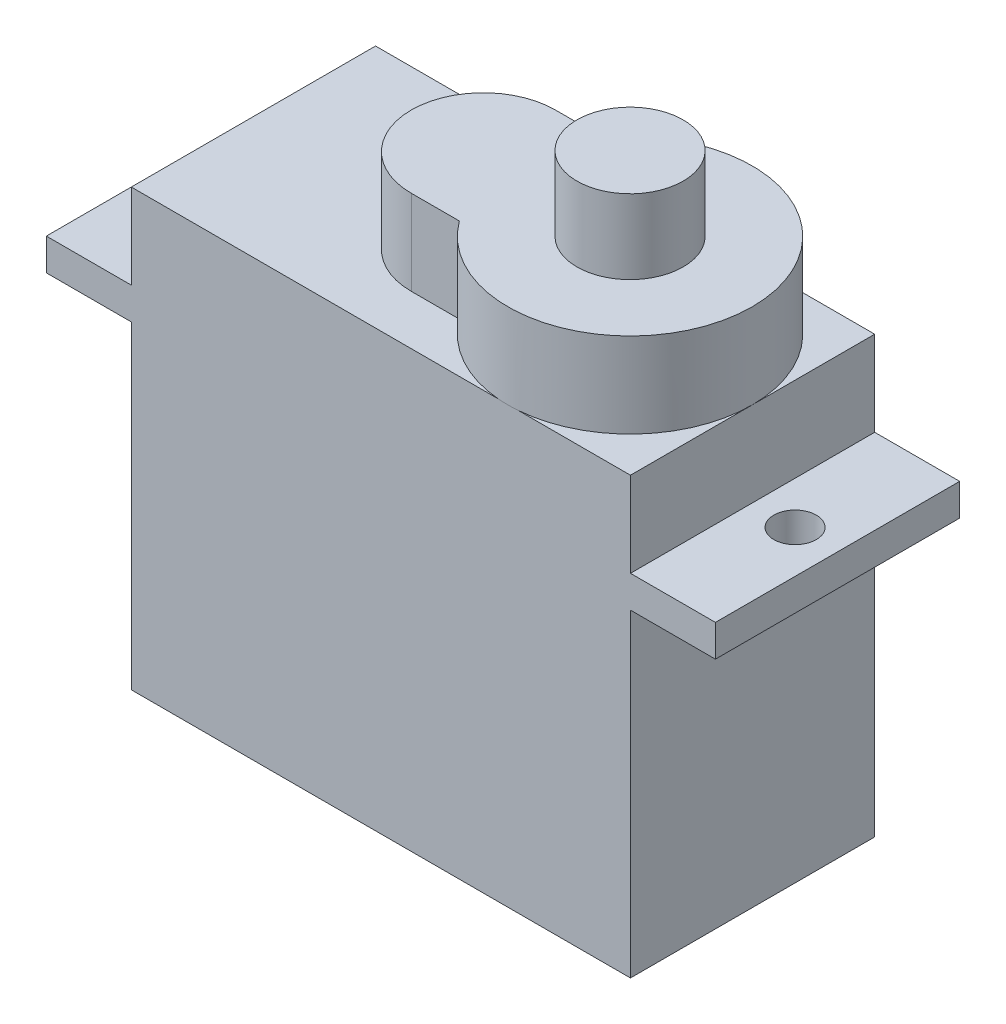
ISO-10303-21;
HEADER;
FILE_DESCRIPTION(('STEP AP214'),'2;1');
FILE_NAME('part.step','',(''),(''),'','','');
FILE_SCHEMA(('AUTOMOTIVE_DESIGN { 1 0 10303 214 1 1 1 1 }'));
ENDSEC;
DATA;
#1=APPLICATION_CONTEXT('core data for automotive mechanical design processes');
#2=APPLICATION_PROTOCOL_DEFINITION('international standard','automotive_design',2000,#1);
#3=PRODUCT_CONTEXT('',#1,'mechanical');
#4=PRODUCT('Part','Part','',(#3));
#5=PRODUCT_RELATED_PRODUCT_CATEGORY('part','',(#4));
#6=PRODUCT_DEFINITION_FORMATION('','',#4);
#7=PRODUCT_DEFINITION_CONTEXT('part definition',#1,'design');
#8=PRODUCT_DEFINITION('design','',#6,#7);
#9=PRODUCT_DEFINITION_SHAPE('','',#8);
#10=(LENGTH_UNIT() NAMED_UNIT(*) SI_UNIT(.MILLI.,.METRE.));
#11=(NAMED_UNIT(*) PLANE_ANGLE_UNIT() SI_UNIT($,.RADIAN.));
#12=(NAMED_UNIT(*) SI_UNIT($,.STERADIAN.) SOLID_ANGLE_UNIT());
#13=UNCERTAINTY_MEASURE_WITH_UNIT(LENGTH_MEASURE(1.E-05),#10,'distance_accuracy_value','');
#14=(GEOMETRIC_REPRESENTATION_CONTEXT(3) GLOBAL_UNCERTAINTY_ASSIGNED_CONTEXT((#13)) GLOBAL_UNIT_ASSIGNED_CONTEXT((#10,
#11,#12)) REPRESENTATION_CONTEXT('',''));
#15=CARTESIAN_POINT('',(0.,0.,0.));
#16=DIRECTION('',(0.,0.,1.));
#17=DIRECTION('',(1.,0.,0.));
#18=AXIS2_PLACEMENT_3D('',#15,#16,#17);
#19=CARTESIAN_POINT('',(15.22,28.,-8.261449094));
#20=DIRECTION('',(0.,1.,0.));
#21=DIRECTION('',(0.,0.,1.));
#22=AXIS2_PLACEMENT_3D('',#19,#20,#21);
#23=PLANE('',#22);
#24=CARTESIAN_POINT('',(17.75,28.,-5.731449094));
#25=DIRECTION('',(0.,-1.,0.));
#26=DIRECTION('',(1.,0.,0.));
#27=AXIS2_PLACEMENT_3D('',#24,#25,#26);
#28=CIRCLE('',#27,2.5);
#29=CARTESIAN_POINT('',(20.25,28.,-5.731449094));
#30=VERTEX_POINT('',#29);
#31=EDGE_CURVE('E21',#30,#30,#28,.F.);
#32=ORIENTED_EDGE('',*,*,#31,.T.);
#33=EDGE_LOOP('',(#32));
#34=FACE_BOUND('',#33,.T.);
#35=ADVANCED_FACE('F17',(#34),#23,.T.);
#36=CARTESIAN_POINT('',(17.75,28.,-5.731449094));
#37=DIRECTION('',(0.,-1.,0.));
#38=DIRECTION('',(1.,0.,0.));
#39=AXIS2_PLACEMENT_3D('',#36,#37,#38);
#40=CYLINDRICAL_SURFACE('',#39,2.5);
#41=CARTESIAN_POINT('',(17.75,24.5,-5.731449094));
#42=DIRECTION('',(0.,-1.,0.));
#43=DIRECTION('',(1.,0.,0.));
#44=AXIS2_PLACEMENT_3D('',#41,#42,#43);
#45=CIRCLE('',#44,2.5);
#46=CARTESIAN_POINT('',(20.25,24.5,-5.731449094));
#47=VERTEX_POINT('',#46);
#48=EDGE_CURVE('E162',#47,#47,#45,.T.);
#49=ORIENTED_EDGE('',*,*,#48,.F.);
#50=EDGE_LOOP('',(#49));
#51=FACE_BOUND('',#50,.T.);
#52=ORIENTED_EDGE('',*,*,#31,.F.);
#53=EDGE_LOOP('',(#52));
#54=FACE_BOUND('',#53,.T.);
#55=ADVANCED_FACE('F390',(#51,#54),#40,.T.);
#56=CARTESIAN_POINT('',(7.353508391,24.5,-11.550449094));
#57=DIRECTION('',(0.,1.,0.));
#58=DIRECTION('',(0.,0.,1.));
#59=AXIS2_PLACEMENT_3D('',#56,#57,#58);
#60=PLANE('',#59);
#61=ORIENTED_EDGE('',*,*,#48,.T.);
#62=EDGE_LOOP('',(#61));
#63=FACE_BOUND('',#62,.T.);
#64=CARTESIAN_POINT('',(17.75,24.5,-5.731449094));
#65=DIRECTION('',(0.,-1.,0.));
#66=DIRECTION('',(1.,0.,0.));
#67=AXIS2_PLACEMENT_3D('',#64,#65,#66);
#68=CIRCLE('',#67,5.75);
#69=CARTESIAN_POINT('',(13.1081034301138,24.5,-2.338029545));
#70=VERTEX_POINT('',#69);
#71=CARTESIAN_POINT('',(13.1081034289888,24.5,-9.12486864130538));
#72=VERTEX_POINT('',#71);
#73=EDGE_CURVE('E137',#70,#72,#68,.F.);
#74=ORIENTED_EDGE('',*,*,#73,.T.);
#75=DIRECTION('',(-1.,0.,0.));
#76=VECTOR('',#75,1.);
#77=CARTESIAN_POINT('',(11.975666256,24.5,-9.124868642));
#78=LINE('',#77,#76);
#79=CARTESIAN_POINT('',(10.843229082,24.5,-9.124868642));
#80=VERTEX_POINT('',#79);
#81=EDGE_CURVE('E166',#72,#80,#78,.T.);
#82=ORIENTED_EDGE('',*,*,#81,.T.);
#83=CARTESIAN_POINT('',(10.843229082,24.5,-5.731449094));
#84=DIRECTION('',(0.,-1.,0.));
#85=DIRECTION('',(1.,0.,0.));
#86=AXIS2_PLACEMENT_3D('',#83,#84,#85);
#87=CIRCLE('',#86,3.393419548);
#88=CARTESIAN_POINT('',(10.843229081304,24.5,-2.3380295455));
#89=VERTEX_POINT('',#88);
#90=EDGE_CURVE('E158',#80,#89,#87,.F.);
#91=ORIENTED_EDGE('',*,*,#90,.T.);
#92=DIRECTION('',(1.,0.,0.));
#93=VECTOR('',#92,1.);
#94=CARTESIAN_POINT('',(11.975666256,24.5,-2.338029545));
#95=LINE('',#94,#93);
#96=EDGE_CURVE('E155',#89,#70,#95,.T.);
#97=ORIENTED_EDGE('',*,*,#96,.T.);
#98=EDGE_LOOP('',(#74,#82,#91,#97));
#99=FACE_BOUND('',#98,.T.);
#100=ADVANCED_FACE('F161',(#63,#99),#60,.T.);
#101=CARTESIAN_POINT('',(13.10810343,20.5,-2.338029545));
#102=DIRECTION('',(0.,0.,-1.));
#103=DIRECTION('',(-1.,0.,0.));
#104=AXIS2_PLACEMENT_3D('',#101,#102,#103);
#105=PLANE('',#104);
#106=DIRECTION('',(0.,-1.,0.));
#107=VECTOR('',#106,1.);
#108=CARTESIAN_POINT('',(13.10810343,22.5,-2.338029545));
#109=LINE('',#108,#107);
#110=CARTESIAN_POINT('',(13.108103429931,20.5,-2.33802954525));
#111=VERTEX_POINT('',#110);
#112=EDGE_CURVE('E141',#70,#111,#109,.T.);
#113=ORIENTED_EDGE('',*,*,#112,.F.);
#114=ORIENTED_EDGE('',*,*,#96,.F.);
#115=DIRECTION('',(0.,1.,0.));
#116=VECTOR('',#115,1.);
#117=CARTESIAN_POINT('',(10.843229080608,22.5,-2.33802954600001));
#118=LINE('',#117,#116);
#119=CARTESIAN_POINT('',(10.843229081304,20.5,-2.33802954575));
#120=VERTEX_POINT('',#119);
#121=EDGE_CURVE('E194',#89,#120,#118,.F.);
#122=ORIENTED_EDGE('',*,*,#121,.T.);
#123=DIRECTION('',(-1.,0.,0.));
#124=VECTOR('',#123,1.);
#125=CARTESIAN_POINT('',(11.75,20.5,-2.3380295455));
#126=LINE('',#125,#124);
#127=EDGE_CURVE('E157',#111,#120,#126,.T.);
#128=ORIENTED_EDGE('',*,*,#127,.F.);
#129=EDGE_LOOP('',(#113,#114,#122,#128));
#130=FACE_BOUND('',#129,.T.);
#131=ADVANCED_FACE('F153',(#130),#105,.F.);
#132=CARTESIAN_POINT('',(10.843229082,24.5,-5.731449094));
#133=DIRECTION('',(0.,-1.,0.));
#134=DIRECTION('',(1.,0.,0.));
#135=AXIS2_PLACEMENT_3D('',#132,#133,#134);
#136=CYLINDRICAL_SURFACE('',#135,3.393419548);
#137=ORIENTED_EDGE('',*,*,#121,.F.);
#138=ORIENTED_EDGE('',*,*,#90,.F.);
#139=DIRECTION('',(0.,-1.,0.));
#140=VECTOR('',#139,1.);
#141=CARTESIAN_POINT('',(10.843229082,22.5,-9.124868642));
#142=LINE('',#141,#140);
#143=CARTESIAN_POINT('',(10.843229082,20.5,-9.1248686395));
#144=VERTEX_POINT('',#143);
#145=EDGE_CURVE('E197',#80,#144,#142,.T.);
#146=ORIENTED_EDGE('',*,*,#145,.T.);
#147=CARTESIAN_POINT('',(10.843229082,20.5,-5.731449094));
#148=DIRECTION('',(0.,-1.,0.));
#149=DIRECTION('',(1.,0.,0.));
#150=AXIS2_PLACEMENT_3D('',#147,#148,#149);
#151=CIRCLE('',#150,3.393419548);
#152=EDGE_CURVE('E189',#120,#144,#151,.T.);
#153=ORIENTED_EDGE('',*,*,#152,.F.);
#154=EDGE_LOOP('',(#137,#138,#146,#153));
#155=FACE_BOUND('',#154,.T.);
#156=ADVANCED_FACE('F360',(#155),#136,.T.);
#157=CARTESIAN_POINT('',(10.843229082,20.5,-9.124868642));
#158=DIRECTION('',(0.,0.,1.));
#159=DIRECTION('',(1.,0.,0.));
#160=AXIS2_PLACEMENT_3D('',#157,#158,#159);
#161=PLANE('',#160);
#162=ORIENTED_EDGE('',*,*,#145,.F.);
#163=ORIENTED_EDGE('',*,*,#81,.F.);
#164=DIRECTION('',(0.,1.,0.));
#165=VECTOR('',#164,1.);
#166=CARTESIAN_POINT('',(13.108103428481,22.5,-9.12486864061076));
#167=LINE('',#166,#165);
#168=CARTESIAN_POINT('',(13.1081034271612,20.5,-9.12486863880538));
#169=VERTEX_POINT('',#168);
#170=EDGE_CURVE('E145',#72,#169,#167,.F.);
#171=ORIENTED_EDGE('',*,*,#170,.T.);
#172=DIRECTION('',(1.,0.,0.));
#173=VECTOR('',#172,1.);
#174=CARTESIAN_POINT('',(11.75,20.5,-9.124868637));
#175=LINE('',#174,#173);
#176=EDGE_CURVE('E188',#144,#169,#175,.T.);
#177=ORIENTED_EDGE('',*,*,#176,.F.);
#178=EDGE_LOOP('',(#162,#163,#171,#177));
#179=FACE_BOUND('',#178,.T.);
#180=ADVANCED_FACE('F362',(#179),#161,.F.);
#181=CARTESIAN_POINT('',(17.75,24.5,-5.731449094));
#182=DIRECTION('',(0.,-1.,0.));
#183=DIRECTION('',(1.,0.,0.));
#184=AXIS2_PLACEMENT_3D('',#181,#182,#183);
#185=CYLINDRICAL_SURFACE('',#184,5.75);
#186=ORIENTED_EDGE('',*,*,#73,.F.);
#187=ORIENTED_EDGE('',*,*,#112,.T.);
#188=CARTESIAN_POINT('',(17.75,20.5,-5.731449094));
#189=DIRECTION('',(0.,-1.,0.));
#190=DIRECTION('',(1.,0.,0.));
#191=AXIS2_PLACEMENT_3D('',#188,#189,#190);
#192=CIRCLE('',#191,5.75);
#193=CARTESIAN_POINT('',(17.2884902113306,20.5,0.));
#194=VERTEX_POINT('',#193);
#195=EDGE_CURVE('E191',#194,#111,#192,.T.);
#196=ORIENTED_EDGE('',*,*,#195,.F.);
#197=CARTESIAN_POINT('',(17.75,20.5,-5.731449094));
#198=DIRECTION('',(0.,-1.,0.));
#199=DIRECTION('',(1.,0.,0.));
#200=AXIS2_PLACEMENT_3D('',#197,#198,#199);
#201=CIRCLE('',#200,5.75);
#202=CARTESIAN_POINT('',(18.2115097892697,20.5,1.20584965623838E-11));
#203=VERTEX_POINT('',#202);
#204=EDGE_CURVE('E183',#194,#203,#201,.F.);
#205=ORIENTED_EDGE('',*,*,#204,.T.);
#206=CARTESIAN_POINT('',(17.75,20.5,-5.731449094));
#207=DIRECTION('',(0.,-1.,0.));
#208=DIRECTION('',(1.,0.,0.));
#209=AXIS2_PLACEMENT_3D('',#206,#207,#208);
#210=CIRCLE('',#209,5.75);
#211=CARTESIAN_POINT('',(23.5,20.5,-5.73144909491033));
#212=VERTEX_POINT('',#211);
#213=EDGE_CURVE('E180',#212,#203,#210,.T.);
#214=ORIENTED_EDGE('',*,*,#213,.F.);
#215=CARTESIAN_POINT('',(17.75,20.5,-5.731449094));
#216=DIRECTION('',(0.,-1.,0.));
#217=DIRECTION('',(1.,0.,0.));
#218=AXIS2_PLACEMENT_3D('',#215,#216,#217);
#219=CIRCLE('',#218,5.75);
#220=EDGE_CURVE('E186',#169,#212,#219,.T.);
#221=ORIENTED_EDGE('',*,*,#220,.F.);
#222=ORIENTED_EDGE('',*,*,#170,.F.);
#223=EDGE_LOOP('',(#186,#187,#196,#205,#214,#221,#222));
#224=FACE_BOUND('',#223,.T.);
#225=ADVANCED_FACE('F139',(#224),#185,.T.);
#226=CARTESIAN_POINT('',(27.5,15.,0.));
#227=DIRECTION('',(1.,0.,0.));
#228=DIRECTION('',(0.,0.,-1.));
#229=AXIS2_PLACEMENT_3D('',#226,#227,#228);
#230=PLANE('',#229);
#231=DIRECTION('',(0.,0.,-1.));
#232=VECTOR('',#231,1.);
#233=CARTESIAN_POINT('',(27.5,16.5,-5.75));
#234=LINE('',#233,#232);
#235=CARTESIAN_POINT('',(27.5,16.500000001125,0.));
#236=VERTEX_POINT('',#235);
#237=CARTESIAN_POINT('',(27.5,16.500000001125,-11.5));
#238=VERTEX_POINT('',#237);
#239=EDGE_CURVE('E179',#236,#238,#234,.T.);
#240=ORIENTED_EDGE('',*,*,#239,.F.);
#241=DIRECTION('',(0.,-1.,0.));
#242=VECTOR('',#241,1.);
#243=CARTESIAN_POINT('',(27.5,15.75,0.));
#244=LINE('',#243,#242);
#245=CARTESIAN_POINT('',(27.5,14.999999999625,0.));
#246=VERTEX_POINT('',#245);
#247=EDGE_CURVE('E192',#236,#246,#244,.T.);
#248=ORIENTED_EDGE('',*,*,#247,.T.);
#249=DIRECTION('',(0.,0.,-1.));
#250=VECTOR('',#249,1.);
#251=CARTESIAN_POINT('',(27.5,15.,-5.75));
#252=LINE('',#251,#250);
#253=CARTESIAN_POINT('',(27.5,14.999999999625,-11.5));
#254=VERTEX_POINT('',#253);
#255=EDGE_CURVE('E175',#246,#254,#252,.T.);
#256=ORIENTED_EDGE('',*,*,#255,.T.);
#257=DIRECTION('',(0.,1.,0.));
#258=VECTOR('',#257,1.);
#259=CARTESIAN_POINT('',(27.5,15.75,-11.5));
#260=LINE('',#259,#258);
#261=EDGE_CURVE('E150',#254,#238,#260,.T.);
#262=ORIENTED_EDGE('',*,*,#261,.T.);
#263=EDGE_LOOP('',(#240,#248,#256,#262));
#264=FACE_BOUND('',#263,.T.);
#265=ADVANCED_FACE('F370',(#264),#230,.T.);
#266=CARTESIAN_POINT('',(25.5,15.,-5.75));
#267=DIRECTION('',(0.,1.,0.));
#268=DIRECTION('',(-1.,0.,0.));
#269=AXIS2_PLACEMENT_3D('',#266,#267,#268);
#270=CYLINDRICAL_SURFACE('',#269,1.);
#271=CARTESIAN_POINT('',(25.5,16.5,-5.75));
#272=DIRECTION('',(0.,1.,0.));
#273=DIRECTION('',(-1.,0.,0.));
#274=AXIS2_PLACEMENT_3D('',#271,#272,#273);
#275=CIRCLE('',#274,1.);
#276=CARTESIAN_POINT('',(24.5,16.5,-5.75));
#277=VERTEX_POINT('',#276);
#278=EDGE_CURVE('E176',#277,#277,#275,.F.);
#279=ORIENTED_EDGE('',*,*,#278,.F.);
#280=EDGE_LOOP('',(#279));
#281=FACE_BOUND('',#280,.T.);
#282=CARTESIAN_POINT('',(25.5,15.,-5.75));
#283=DIRECTION('',(0.,1.,0.));
#284=DIRECTION('',(-1.,0.,0.));
#285=AXIS2_PLACEMENT_3D('',#282,#283,#284);
#286=CIRCLE('',#285,1.);
#287=CARTESIAN_POINT('',(24.5,15.,-5.75));
#288=VERTEX_POINT('',#287);
#289=EDGE_CURVE('E171',#288,#288,#286,.F.);
#290=ORIENTED_EDGE('',*,*,#289,.T.);
#291=EDGE_LOOP('',(#290));
#292=FACE_BOUND('',#291,.T.);
#293=ADVANCED_FACE('F386',(#281,#292),#270,.F.);
#294=CARTESIAN_POINT('',(0.,20.5,-11.5));
#295=DIRECTION('',(0.,1.,0.));
#296=DIRECTION('',(0.,0.,1.));
#297=AXIS2_PLACEMENT_3D('',#294,#295,#296);
#298=PLANE('',#297);
#299=ORIENTED_EDGE('',*,*,#176,.T.);
#300=ORIENTED_EDGE('',*,*,#220,.T.);
#301=DIRECTION('',(0.,0.,-1.));
#302=VECTOR('',#301,1.);
#303=CARTESIAN_POINT('',(23.5,20.5,-5.75));
#304=LINE('',#303,#302);
#305=CARTESIAN_POINT('',(23.4999999999375,20.5,-11.5));
#306=VERTEX_POINT('',#305);
#307=EDGE_CURVE('E211',#212,#306,#304,.T.);
#308=ORIENTED_EDGE('',*,*,#307,.T.);
#309=DIRECTION('',(-1.,0.,0.));
#310=VECTOR('',#309,1.);
#311=CARTESIAN_POINT('',(11.75,20.5,-11.5));
#312=LINE('',#311,#310);
#313=CARTESIAN_POINT('',(0.,20.5,-11.5));
#314=VERTEX_POINT('',#313);
#315=EDGE_CURVE('E207',#306,#314,#312,.T.);
#316=ORIENTED_EDGE('',*,*,#315,.T.);
#317=DIRECTION('',(0.,0.,1.));
#318=VECTOR('',#317,1.);
#319=CARTESIAN_POINT('',(0.,20.5,-5.75));
#320=LINE('',#319,#318);
#321=CARTESIAN_POINT('',(3.33329573433868E-10,20.5,0.));
#322=VERTEX_POINT('',#321);
#323=EDGE_CURVE('E237',#314,#322,#320,.T.);
#324=ORIENTED_EDGE('',*,*,#323,.T.);
#325=DIRECTION('',(1.,0.,0.));
#326=VECTOR('',#325,1.);
#327=CARTESIAN_POINT('',(11.75,20.5,0.));
#328=LINE('',#327,#326);
#329=EDGE_CURVE('E246',#322,#194,#328,.T.);
#330=ORIENTED_EDGE('',*,*,#329,.T.);
#331=ORIENTED_EDGE('',*,*,#195,.T.);
#332=ORIENTED_EDGE('',*,*,#127,.T.);
#333=ORIENTED_EDGE('',*,*,#152,.T.);
#334=EDGE_LOOP('',(#299,#300,#308,#316,#324,#330,#331,#332,#333));
#335=FACE_BOUND('',#334,.T.);
#336=ADVANCED_FACE('F343',(#335),#298,.T.);
#337=CARTESIAN_POINT('',(17.282952094,20.5,0.));
#338=DIRECTION('',(0.,1.,0.));
#339=DIRECTION('',(0.,0.,1.));
#340=AXIS2_PLACEMENT_3D('',#337,#338,#339);
#341=PLANE('',#340);
#342=DIRECTION('',(1.,0.,0.));
#343=VECTOR('',#342,1.);
#344=CARTESIAN_POINT('',(11.75,20.5,0.));
#345=LINE('',#344,#343);
#346=EDGE_CURVE('E254',#194,#203,#345,.T.);
#347=ORIENTED_EDGE('',*,*,#346,.T.);
#348=ORIENTED_EDGE('',*,*,#204,.F.);
#349=EDGE_LOOP('',(#347,#348));
#350=FACE_BOUND('',#349,.T.);
#351=ADVANCED_FACE('F356',(#350),#341,.F.);
#352=CARTESIAN_POINT('',(18.179778847,20.5,-5.765837788));
#353=DIRECTION('',(0.,1.,0.));
#354=DIRECTION('',(0.,0.,1.));
#355=AXIS2_PLACEMENT_3D('',#352,#353,#354);
#356=PLANE('',#355);
#357=DIRECTION('',(1.,0.,0.));
#358=VECTOR('',#357,1.);
#359=CARTESIAN_POINT('',(11.75,20.5,0.));
#360=LINE('',#359,#358);
#361=CARTESIAN_POINT('',(23.49999999975,20.5,0.));
#362=VERTEX_POINT('',#361);
#363=EDGE_CURVE('E265',#203,#362,#360,.T.);
#364=ORIENTED_EDGE('',*,*,#363,.T.);
#365=DIRECTION('',(0.,0.,-1.));
#366=VECTOR('',#365,1.);
#367=CARTESIAN_POINT('',(23.5,20.5,-5.75));
#368=LINE('',#367,#366);
#369=EDGE_CURVE('E182',#362,#212,#368,.T.);
#370=ORIENTED_EDGE('',*,*,#369,.T.);
#371=ORIENTED_EDGE('',*,*,#213,.T.);
#372=EDGE_LOOP('',(#364,#370,#371));
#373=FACE_BOUND('',#372,.T.);
#374=ADVANCED_FACE('F350',(#373),#356,.T.);
#375=CARTESIAN_POINT('',(23.5,16.5,-11.5));
#376=DIRECTION('',(-1.,0.,0.));
#377=DIRECTION('',(0.,0.,1.));
#378=AXIS2_PLACEMENT_3D('',#375,#376,#377);
#379=PLANE('',#378);
#380=DIRECTION('',(0.,1.,0.));
#381=VECTOR('',#380,1.);
#382=CARTESIAN_POINT('',(23.4999999995,10.25,-11.5));
#383=LINE('',#382,#381);
#384=CARTESIAN_POINT('',(23.499999999875,16.500000001125,-11.5));
#385=VERTEX_POINT('',#384);
#386=EDGE_CURVE('E204',#385,#306,#383,.T.);
#387=ORIENTED_EDGE('',*,*,#386,.T.);
#388=ORIENTED_EDGE('',*,*,#307,.F.);
#389=ORIENTED_EDGE('',*,*,#369,.F.);
#390=DIRECTION('',(0.,-1.,0.));
#391=VECTOR('',#390,1.);
#392=CARTESIAN_POINT('',(23.4999999995,10.25,0.));
#393=LINE('',#392,#391);
#394=CARTESIAN_POINT('',(23.499999999875,16.500000001125,0.));
#395=VERTEX_POINT('',#394);
#396=EDGE_CURVE('E261',#362,#395,#393,.T.);
#397=ORIENTED_EDGE('',*,*,#396,.T.);
#398=DIRECTION('',(0.,0.,1.));
#399=VECTOR('',#398,1.);
#400=CARTESIAN_POINT('',(23.5,16.5,-5.75));
#401=LINE('',#400,#399);
#402=EDGE_CURVE('E213',#385,#395,#401,.T.);
#403=ORIENTED_EDGE('',*,*,#402,.F.);
#404=EDGE_LOOP('',(#387,#388,#389,#397,#403));
#405=FACE_BOUND('',#404,.T.);
#406=ADVANCED_FACE('F347',(#405),#379,.F.);
#407=CARTESIAN_POINT('',(23.5,16.5,-11.5));
#408=DIRECTION('',(0.,1.,0.));
#409=DIRECTION('',(0.,0.,1.));
#410=AXIS2_PLACEMENT_3D('',#407,#408,#409);
#411=PLANE('',#410);
#412=ORIENTED_EDGE('',*,*,#278,.T.);
#413=EDGE_LOOP('',(#412));
#414=FACE_BOUND('',#413,.T.);
#415=ORIENTED_EDGE('',*,*,#239,.T.);
#416=DIRECTION('',(-1.,0.,0.));
#417=VECTOR('',#416,1.);
#418=CARTESIAN_POINT('',(11.75,16.5000000045,-11.5));
#419=LINE('',#418,#417);
#420=EDGE_CURVE('E208',#238,#385,#419,.T.);
#421=ORIENTED_EDGE('',*,*,#420,.T.);
#422=ORIENTED_EDGE('',*,*,#402,.T.);
#423=DIRECTION('',(1.,0.,0.));
#424=VECTOR('',#423,1.);
#425=CARTESIAN_POINT('',(11.75,16.5000000045,0.));
#426=LINE('',#425,#424);
#427=EDGE_CURVE('E264',#395,#236,#426,.T.);
#428=ORIENTED_EDGE('',*,*,#427,.T.);
#429=EDGE_LOOP('',(#415,#421,#422,#428));
#430=FACE_BOUND('',#429,.T.);
#431=ADVANCED_FACE('F470',(#414,#430),#411,.T.);
#432=CARTESIAN_POINT('',(23.5,15.,-11.5));
#433=DIRECTION('',(0.,1.,0.));
#434=DIRECTION('',(0.,0.,1.));
#435=AXIS2_PLACEMENT_3D('',#432,#433,#434);
#436=PLANE('',#435);
#437=ORIENTED_EDGE('',*,*,#289,.F.);
#438=EDGE_LOOP('',(#437));
#439=FACE_BOUND('',#438,.T.);
#440=DIRECTION('',(0.,0.,-1.));
#441=VECTOR('',#440,1.);
#442=CARTESIAN_POINT('',(23.5,15.,-5.75));
#443=LINE('',#442,#441);
#444=CARTESIAN_POINT('',(23.499999999875,14.999999999625,0.));
#445=VERTEX_POINT('',#444);
#446=CARTESIAN_POINT('',(23.499999999875,14.999999999625,-11.5));
#447=VERTEX_POINT('',#446);
#448=EDGE_CURVE('E174',#445,#447,#443,.T.);
#449=ORIENTED_EDGE('',*,*,#448,.T.);
#450=DIRECTION('',(1.,0.,0.));
#451=VECTOR('',#450,1.);
#452=CARTESIAN_POINT('',(11.75,14.9999999985,-11.5));
#453=LINE('',#452,#451);
#454=EDGE_CURVE('E284',#447,#254,#453,.T.);
#455=ORIENTED_EDGE('',*,*,#454,.T.);
#456=ORIENTED_EDGE('',*,*,#255,.F.);
#457=DIRECTION('',(-1.,0.,0.));
#458=VECTOR('',#457,1.);
#459=CARTESIAN_POINT('',(11.75,14.9999999985,0.));
#460=LINE('',#459,#458);
#461=EDGE_CURVE('E302',#246,#445,#460,.T.);
#462=ORIENTED_EDGE('',*,*,#461,.T.);
#463=EDGE_LOOP('',(#449,#455,#456,#462));
#464=FACE_BOUND('',#463,.T.);
#465=ADVANCED_FACE('F479',(#439,#464),#436,.F.);
#466=CARTESIAN_POINT('',(23.5,0.,-11.5));
#467=DIRECTION('',(-1.,0.,0.));
#468=DIRECTION('',(0.,0.,1.));
#469=AXIS2_PLACEMENT_3D('',#466,#467,#468);
#470=PLANE('',#469);
#471=DIRECTION('',(0.,1.,0.));
#472=VECTOR('',#471,1.);
#473=CARTESIAN_POINT('',(23.4999999995,10.25,-11.5));
#474=LINE('',#473,#472);
#475=CARTESIAN_POINT('',(23.499999999875,0.,-11.5));
#476=VERTEX_POINT('',#475);
#477=EDGE_CURVE('E239',#476,#447,#474,.T.);
#478=ORIENTED_EDGE('',*,*,#477,.T.);
#479=ORIENTED_EDGE('',*,*,#448,.F.);
#480=DIRECTION('',(0.,-1.,0.));
#481=VECTOR('',#480,1.);
#482=CARTESIAN_POINT('',(23.4999999995,10.25,0.));
#483=LINE('',#482,#481);
#484=CARTESIAN_POINT('',(23.499999999875,0.,0.));
#485=VERTEX_POINT('',#484);
#486=EDGE_CURVE('E305',#445,#485,#483,.T.);
#487=ORIENTED_EDGE('',*,*,#486,.T.);
#488=DIRECTION('',(0.,0.,-1.));
#489=VECTOR('',#488,1.);
#490=CARTESIAN_POINT('',(23.5,0.,-5.75));
#491=LINE('',#490,#489);
#492=EDGE_CURVE('E278',#485,#476,#491,.T.);
#493=ORIENTED_EDGE('',*,*,#492,.T.);
#494=EDGE_LOOP('',(#478,#479,#487,#493));
#495=FACE_BOUND('',#494,.T.);
#496=ADVANCED_FACE('F489',(#495),#470,.F.);
#497=CARTESIAN_POINT('',(0.,0.,-11.5));
#498=DIRECTION('',(0.,1.,0.));
#499=DIRECTION('',(0.,0.,1.));
#500=AXIS2_PLACEMENT_3D('',#497,#498,#499);
#501=PLANE('',#500);
#502=DIRECTION('',(1.,0.,0.));
#503=VECTOR('',#502,1.);
#504=CARTESIAN_POINT('',(11.75,0.,-11.5));
#505=LINE('',#504,#503);
#506=CARTESIAN_POINT('',(1.24999945290416E-10,0.,-11.5));
#507=VERTEX_POINT('',#506);
#508=EDGE_CURVE('E291',#507,#476,#505,.T.);
#509=ORIENTED_EDGE('',*,*,#508,.T.);
#510=ORIENTED_EDGE('',*,*,#492,.F.);
#511=DIRECTION('',(-1.,0.,0.));
#512=VECTOR('',#511,1.);
#513=CARTESIAN_POINT('',(11.75,0.,0.));
#514=LINE('',#513,#512);
#515=CARTESIAN_POINT('',(1.249985900377E-10,0.,0.));
#516=VERTEX_POINT('',#515);
#517=EDGE_CURVE('E308',#485,#516,#514,.T.);
#518=ORIENTED_EDGE('',*,*,#517,.T.);
#519=DIRECTION('',(0.,0.,-1.));
#520=VECTOR('',#519,1.);
#521=CARTESIAN_POINT('',(0.,0.,-5.75));
#522=LINE('',#521,#520);
#523=EDGE_CURVE('E240',#516,#507,#522,.T.);
#524=ORIENTED_EDGE('',*,*,#523,.T.);
#525=EDGE_LOOP('',(#509,#510,#518,#524));
#526=FACE_BOUND('',#525,.T.);
#527=ADVANCED_FACE('F499',(#526),#501,.F.);
#528=CARTESIAN_POINT('',(0.,0.,0.));
#529=DIRECTION('',(1.,0.,0.));
#530=DIRECTION('',(0.,0.,-1.));
#531=AXIS2_PLACEMENT_3D('',#528,#529,#530);
#532=PLANE('',#531);
#533=DIRECTION('',(0.,1.,0.));
#534=VECTOR('',#533,1.);
#535=CARTESIAN_POINT('',(4.99994576991236E-10,10.25,0.));
#536=LINE('',#535,#534);
#537=CARTESIAN_POINT('',(2.49997180075401E-10,14.99999999925,0.));
#538=VERTEX_POINT('',#537);
#539=EDGE_CURVE('E297',#516,#538,#536,.T.);
#540=ORIENTED_EDGE('',*,*,#539,.T.);
#541=DIRECTION('',(0.,0.,-1.));
#542=VECTOR('',#541,1.);
#543=CARTESIAN_POINT('',(0.,15.,-5.75));
#544=LINE('',#543,#542);
#545=CARTESIAN_POINT('',(1.24999945290416E-10,14.999999999625,-11.5));
#546=VERTEX_POINT('',#545);
#547=EDGE_CURVE('E317',#538,#546,#544,.T.);
#548=ORIENTED_EDGE('',*,*,#547,.T.);
#549=DIRECTION('',(0.,-1.,0.));
#550=VECTOR('',#549,1.);
#551=CARTESIAN_POINT('',(5.00000214842533E-10,10.25,-11.5));
#552=LINE('',#551,#550);
#553=EDGE_CURVE('E225',#546,#507,#552,.T.);
#554=ORIENTED_EDGE('',*,*,#553,.T.);
#555=ORIENTED_EDGE('',*,*,#523,.F.);
#556=EDGE_LOOP('',(#540,#548,#554,#555));
#557=FACE_BOUND('',#556,.T.);
#558=ADVANCED_FACE('F509',(#557),#532,.F.);
#559=CARTESIAN_POINT('',(0.,16.5,0.));
#560=DIRECTION('',(1.,0.,0.));
#561=DIRECTION('',(0.,0.,-1.));
#562=AXIS2_PLACEMENT_3D('',#559,#560,#561);
#563=PLANE('',#562);
#564=DIRECTION('',(0.,1.,0.));
#565=VECTOR('',#564,1.);
#566=CARTESIAN_POINT('',(4.99994576991236E-10,10.25,0.));
#567=LINE('',#566,#565);
#568=CARTESIAN_POINT('',(4.99994576991236E-10,16.500000001125,0.));
#569=VERTEX_POINT('',#568);
#570=EDGE_CURVE('E243',#569,#322,#567,.T.);
#571=ORIENTED_EDGE('',*,*,#570,.T.);
#572=ORIENTED_EDGE('',*,*,#323,.F.);
#573=DIRECTION('',(0.,-1.,0.));
#574=VECTOR('',#573,1.);
#575=CARTESIAN_POINT('',(5.00000214842533E-10,10.25,-11.5));
#576=LINE('',#575,#574);
#577=CARTESIAN_POINT('',(1.24999945290416E-10,16.500000001125,-11.5));
#578=VERTEX_POINT('',#577);
#579=EDGE_CURVE('E220',#314,#578,#576,.T.);
#580=ORIENTED_EDGE('',*,*,#579,.T.);
#581=DIRECTION('',(0.,0.,-1.));
#582=VECTOR('',#581,1.);
#583=CARTESIAN_POINT('',(0.,16.5,-5.75));
#584=LINE('',#583,#582);
#585=EDGE_CURVE('E228',#569,#578,#584,.T.);
#586=ORIENTED_EDGE('',*,*,#585,.F.);
#587=EDGE_LOOP('',(#571,#572,#580,#586));
#588=FACE_BOUND('',#587,.T.);
#589=ADVANCED_FACE('F339',(#588),#563,.F.);
#590=CARTESIAN_POINT('',(-4.,0.,-11.5));
#591=DIRECTION('',(0.,0.,1.));
#592=DIRECTION('',(1.,0.,0.));
#593=AXIS2_PLACEMENT_3D('',#590,#591,#592);
#594=PLANE('',#593);
#595=ORIENTED_EDGE('',*,*,#553,.F.);
#596=DIRECTION('',(-1.,0.,0.));
#597=VECTOR('',#596,1.);
#598=CARTESIAN_POINT('',(-2.,15.,-11.5));
#599=LINE('',#598,#597);
#600=CARTESIAN_POINT('',(-4.,14.999999999625,-11.5));
#601=VERTEX_POINT('',#600);
#602=EDGE_CURVE('E231',#546,#601,#599,.T.);
#603=ORIENTED_EDGE('',*,*,#602,.T.);
#604=DIRECTION('',(0.,1.,0.));
#605=VECTOR('',#604,1.);
#606=CARTESIAN_POINT('',(-4.,15.75,-11.5));
#607=LINE('',#606,#605);
#608=CARTESIAN_POINT('',(-4.,16.50000000225,-11.5));
#609=VERTEX_POINT('',#608);
#610=EDGE_CURVE('E294',#601,#609,#607,.T.);
#611=ORIENTED_EDGE('',*,*,#610,.T.);
#612=DIRECTION('',(-1.,0.,0.));
#613=VECTOR('',#612,1.);
#614=CARTESIAN_POINT('',(-2.,16.5,-11.5));
#615=LINE('',#614,#613);
#616=EDGE_CURVE('E230',#578,#609,#615,.T.);
#617=ORIENTED_EDGE('',*,*,#616,.F.);
#618=ORIENTED_EDGE('',*,*,#579,.F.);
#619=ORIENTED_EDGE('',*,*,#315,.F.);
#620=ORIENTED_EDGE('',*,*,#386,.F.);
#621=ORIENTED_EDGE('',*,*,#420,.F.);
#622=ORIENTED_EDGE('',*,*,#261,.F.);
#623=ORIENTED_EDGE('',*,*,#454,.F.);
#624=ORIENTED_EDGE('',*,*,#477,.F.);
#625=ORIENTED_EDGE('',*,*,#508,.F.);
#626=EDGE_LOOP('',(#595,#603,#611,#617,#618,#619,#620,#621,#622,#623,#624,#625));
#627=FACE_BOUND('',#626,.T.);
#628=ADVANCED_FACE('F327',(#627),#594,.F.);
#629=CARTESIAN_POINT('',(-4.,15.,0.));
#630=DIRECTION('',(1.,0.,0.));
#631=DIRECTION('',(0.,0.,-1.));
#632=AXIS2_PLACEMENT_3D('',#629,#630,#631);
#633=PLANE('',#632);
#634=DIRECTION('',(0.,1.,0.));
#635=VECTOR('',#634,1.);
#636=CARTESIAN_POINT('',(-4.,10.25,0.));
#637=LINE('',#636,#635);
#638=CARTESIAN_POINT('',(-4.,14.999999999625,0.));
#639=VERTEX_POINT('',#638);
#640=CARTESIAN_POINT('',(-4.,16.500000001125,0.));
#641=VERTEX_POINT('',#640);
#642=EDGE_CURVE('E247',#639,#641,#637,.T.);
#643=ORIENTED_EDGE('',*,*,#642,.T.);
#644=DIRECTION('',(0.,0.,1.));
#645=VECTOR('',#644,1.);
#646=CARTESIAN_POINT('',(-4.,16.5,-5.75));
#647=LINE('',#646,#645);
#648=EDGE_CURVE('E36',#609,#641,#647,.T.);
#649=ORIENTED_EDGE('',*,*,#648,.F.);
#650=ORIENTED_EDGE('',*,*,#610,.F.);
#651=DIRECTION('',(0.,0.,1.));
#652=VECTOR('',#651,1.);
#653=CARTESIAN_POINT('',(-4.,15.,-5.75));
#654=LINE('',#653,#652);
#655=EDGE_CURVE('E311',#601,#639,#654,.T.);
#656=ORIENTED_EDGE('',*,*,#655,.T.);
#657=EDGE_LOOP('',(#643,#649,#650,#656));
#658=FACE_BOUND('',#657,.T.);
#659=ADVANCED_FACE('F331',(#658),#633,.F.);
#660=CARTESIAN_POINT('',(27.5,0.,0.));
#661=DIRECTION('',(0.,0.,-1.));
#662=DIRECTION('',(-1.,0.,0.));
#663=AXIS2_PLACEMENT_3D('',#660,#661,#662);
#664=PLANE('',#663);
#665=ORIENTED_EDGE('',*,*,#486,.F.);
#666=ORIENTED_EDGE('',*,*,#461,.F.);
#667=ORIENTED_EDGE('',*,*,#247,.F.);
#668=ORIENTED_EDGE('',*,*,#427,.F.);
#669=ORIENTED_EDGE('',*,*,#396,.F.);
#670=ORIENTED_EDGE('',*,*,#363,.F.);
#671=ORIENTED_EDGE('',*,*,#346,.F.);
#672=ORIENTED_EDGE('',*,*,#329,.F.);
#673=ORIENTED_EDGE('',*,*,#570,.F.);
#674=DIRECTION('',(1.,0.,0.));
#675=VECTOR('',#674,1.);
#676=CARTESIAN_POINT('',(-2.,16.5,0.));
#677=LINE('',#676,#675);
#678=EDGE_CURVE('E170',#641,#569,#677,.T.);
#679=ORIENTED_EDGE('',*,*,#678,.F.);
#680=ORIENTED_EDGE('',*,*,#642,.F.);
#681=DIRECTION('',(1.,0.,0.));
#682=VECTOR('',#681,1.);
#683=CARTESIAN_POINT('',(-2.,15.,0.));
#684=LINE('',#683,#682);
#685=EDGE_CURVE('E314',#639,#538,#684,.T.);
#686=ORIENTED_EDGE('',*,*,#685,.T.);
#687=ORIENTED_EDGE('',*,*,#539,.F.);
#688=ORIENTED_EDGE('',*,*,#517,.F.);
#689=EDGE_LOOP('',(#665,#666,#667,#668,#669,#670,#671,#672,#673,#679,#680,#686,#687,#688));
#690=FACE_BOUND('',#689,.T.);
#691=ADVANCED_FACE('F336',(#690),#664,.F.);
#692=CARTESIAN_POINT('',(-4.,15.,-11.5));
#693=DIRECTION('',(0.,1.,0.));
#694=DIRECTION('',(0.,0.,1.));
#695=AXIS2_PLACEMENT_3D('',#692,#693,#694);
#696=PLANE('',#695);
#697=CARTESIAN_POINT('',(-2.,15.,-5.75));
#698=DIRECTION('',(0.,1.,0.));
#699=DIRECTION('',(-1.,0.,0.));
#700=AXIS2_PLACEMENT_3D('',#697,#698,#699);
#701=CIRCLE('',#700,1.);
#702=CARTESIAN_POINT('',(-3.,15.,-5.75));
#703=VERTEX_POINT('',#702);
#704=EDGE_CURVE('E27',#703,#703,#701,.F.);
#705=ORIENTED_EDGE('',*,*,#704,.F.);
#706=EDGE_LOOP('',(#705));
#707=FACE_BOUND('',#706,.T.);
#708=ORIENTED_EDGE('',*,*,#547,.F.);
#709=ORIENTED_EDGE('',*,*,#685,.F.);
#710=ORIENTED_EDGE('',*,*,#655,.F.);
#711=ORIENTED_EDGE('',*,*,#602,.F.);
#712=EDGE_LOOP('',(#708,#709,#710,#711));
#713=FACE_BOUND('',#712,.T.);
#714=ADVANCED_FACE('F382',(#707,#713),#696,.F.);
#715=CARTESIAN_POINT('',(-4.,16.5,-11.5));
#716=DIRECTION('',(0.,1.,0.));
#717=DIRECTION('',(0.,0.,1.));
#718=AXIS2_PLACEMENT_3D('',#715,#716,#717);
#719=PLANE('',#718);
#720=CARTESIAN_POINT('',(-2.,16.5,-5.75));
#721=DIRECTION('',(0.,1.,0.));
#722=DIRECTION('',(-1.,0.,0.));
#723=AXIS2_PLACEMENT_3D('',#720,#721,#722);
#724=CIRCLE('',#723,1.);
#725=CARTESIAN_POINT('',(-3.,16.5,-5.75));
#726=VERTEX_POINT('',#725);
#727=EDGE_CURVE('E11',#726,#726,#724,.T.);
#728=ORIENTED_EDGE('',*,*,#727,.F.);
#729=EDGE_LOOP('',(#728));
#730=FACE_BOUND('',#729,.T.);
#731=ORIENTED_EDGE('',*,*,#648,.T.);
#732=ORIENTED_EDGE('',*,*,#678,.T.);
#733=ORIENTED_EDGE('',*,*,#585,.T.);
#734=ORIENTED_EDGE('',*,*,#616,.T.);
#735=EDGE_LOOP('',(#731,#732,#733,#734));
#736=FACE_BOUND('',#735,.T.);
#737=ADVANCED_FACE('F19',(#730,#736),#719,.T.);
#738=CARTESIAN_POINT('',(-2.,15.,-5.75));
#739=DIRECTION('',(0.,1.,0.));
#740=DIRECTION('',(-1.,0.,0.));
#741=AXIS2_PLACEMENT_3D('',#738,#739,#740);
#742=CYLINDRICAL_SURFACE('',#741,1.);
#743=ORIENTED_EDGE('',*,*,#704,.T.);
#744=EDGE_LOOP('',(#743));
#745=FACE_BOUND('',#744,.T.);
#746=ORIENTED_EDGE('',*,*,#727,.T.);
#747=EDGE_LOOP('',(#746));
#748=FACE_BOUND('',#747,.T.);
#749=ADVANCED_FACE('F375',(#745,#748),#742,.F.);
#750=CLOSED_SHELL('',(#35,#55,#100,#131,#156,#180,#225,#265,#293,#336,#351,#374,#406,#431,#465,
#496,#527,#558,#589,#628,#659,#691,#714,#737,#749));
#751=MANIFOLD_SOLID_BREP('B1',#750);
#752=ADVANCED_BREP_SHAPE_REPRESENTATION('',(#18,#751),#14);
#753=SHAPE_DEFINITION_REPRESENTATION(#9,#752);
ENDSEC;
END-ISO-10303-21;
